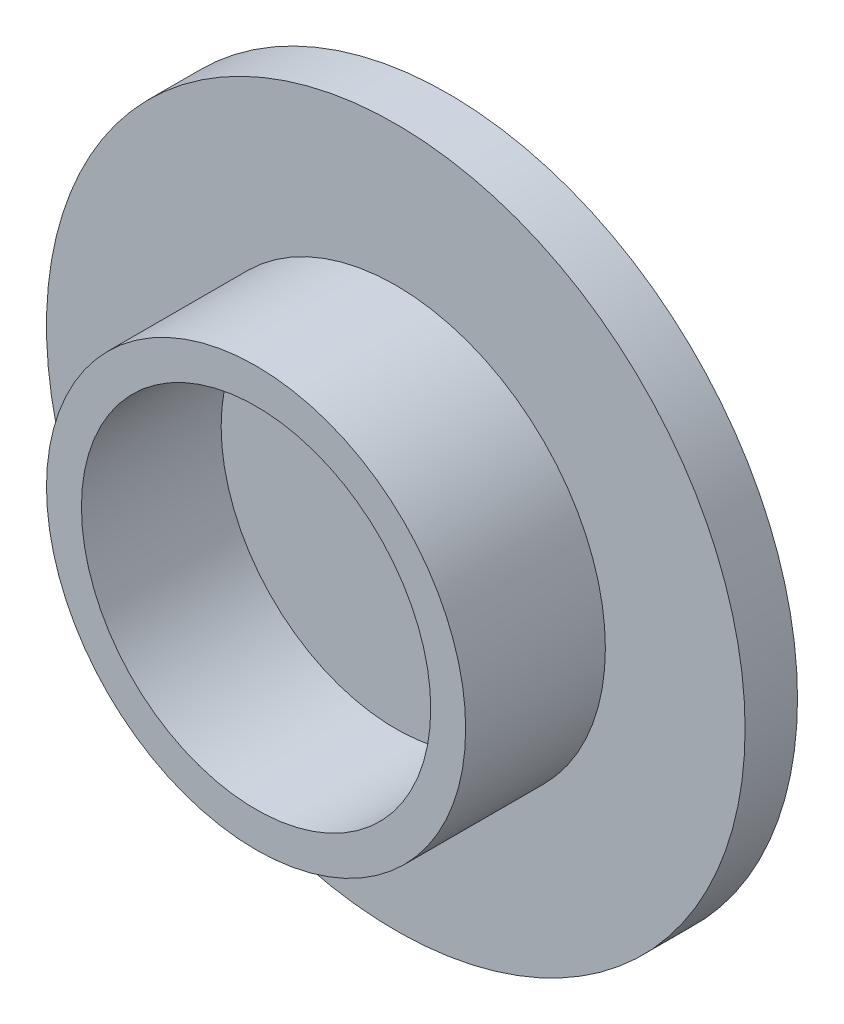
ISO-10303-21;
HEADER;
FILE_DESCRIPTION(('STEP AP214'),'2;1');
FILE_NAME('part.step','',(''),(''),'','','');
FILE_SCHEMA(('AUTOMOTIVE_DESIGN { 1 0 10303 214 1 1 1 1 }'));
ENDSEC;
DATA;
#1=APPLICATION_CONTEXT('core data for automotive mechanical design processes');
#2=APPLICATION_PROTOCOL_DEFINITION('international standard','automotive_design',2000,#1);
#3=PRODUCT_CONTEXT('',#1,'mechanical');
#4=PRODUCT('Part','Part','',(#3));
#5=PRODUCT_RELATED_PRODUCT_CATEGORY('part','',(#4));
#6=PRODUCT_DEFINITION_FORMATION('','',#4);
#7=PRODUCT_DEFINITION_CONTEXT('part definition',#1,'design');
#8=PRODUCT_DEFINITION('design','',#6,#7);
#9=PRODUCT_DEFINITION_SHAPE('','',#8);
#10=(LENGTH_UNIT() NAMED_UNIT(*) SI_UNIT(.MILLI.,.METRE.));
#11=(NAMED_UNIT(*) PLANE_ANGLE_UNIT() SI_UNIT($,.RADIAN.));
#12=(NAMED_UNIT(*) SI_UNIT($,.STERADIAN.) SOLID_ANGLE_UNIT());
#13=UNCERTAINTY_MEASURE_WITH_UNIT(LENGTH_MEASURE(1.E-05),#10,'distance_accuracy_value','');
#14=(GEOMETRIC_REPRESENTATION_CONTEXT(3) GLOBAL_UNCERTAINTY_ASSIGNED_CONTEXT((#13)) GLOBAL_UNIT_ASSIGNED_CONTEXT((#10,
#11,#12)) REPRESENTATION_CONTEXT('',''));
#15=CARTESIAN_POINT('',(0.,0.,0.));
#16=DIRECTION('',(0.,0.,1.));
#17=DIRECTION('',(1.,0.,0.));
#18=AXIS2_PLACEMENT_3D('',#15,#16,#17);
#19=CARTESIAN_POINT('',(0.,0.,3.));
#20=DIRECTION('',(0.,0.,-1.));
#21=DIRECTION('',(-1.,0.,0.));
#22=AXIS2_PLACEMENT_3D('',#19,#20,#21);
#23=CYLINDRICAL_SURFACE('',#22,20.);
#24=CARTESIAN_POINT('',(0.,0.,3.));
#25=DIRECTION('',(0.,0.,1.));
#26=DIRECTION('',(1.,0.,0.));
#27=AXIS2_PLACEMENT_3D('',#24,#25,#26);
#28=CIRCLE('',#27,20.);
#29=CARTESIAN_POINT('',(20.,0.,3.));
#30=VERTEX_POINT('',#29);
#31=EDGE_CURVE('E44',#30,#30,#28,.T.);
#32=ORIENTED_EDGE('',*,*,#31,.F.);
#33=EDGE_LOOP('',(#32));
#34=FACE_BOUND('',#33,.T.);
#35=CARTESIAN_POINT('',(0.,0.,0.));
#36=DIRECTION('',(0.,0.,1.));
#37=DIRECTION('',(1.,0.,0.));
#38=AXIS2_PLACEMENT_3D('',#35,#36,#37);
#39=CIRCLE('',#38,20.);
#40=CARTESIAN_POINT('',(20.,0.,0.));
#41=VERTEX_POINT('',#40);
#42=EDGE_CURVE('E49',#41,#41,#39,.T.);
#43=ORIENTED_EDGE('',*,*,#42,.T.);
#44=EDGE_LOOP('',(#43));
#45=FACE_BOUND('',#44,.T.);
#46=ADVANCED_FACE('F37',(#34,#45),#23,.T.);
#47=CARTESIAN_POINT('',(0.,0.,3.));
#48=DIRECTION('',(0.,0.,1.));
#49=DIRECTION('',(1.,0.,0.));
#50=AXIS2_PLACEMENT_3D('',#47,#48,#49);
#51=PLANE('',#50);
#52=CARTESIAN_POINT('',(0.,0.,3.));
#53=DIRECTION('',(0.,0.,1.));
#54=DIRECTION('',(1.,0.,0.));
#55=AXIS2_PLACEMENT_3D('',#52,#53,#54);
#56=CIRCLE('',#55,12.);
#57=CARTESIAN_POINT('',(12.,0.,3.));
#58=VERTEX_POINT('',#57);
#59=EDGE_CURVE('E57',#58,#58,#56,.T.);
#60=ORIENTED_EDGE('',*,*,#59,.F.);
#61=EDGE_LOOP('',(#60));
#62=FACE_BOUND('',#61,.T.);
#63=ORIENTED_EDGE('',*,*,#31,.T.);
#64=EDGE_LOOP('',(#63));
#65=FACE_BOUND('',#64,.T.);
#66=ADVANCED_FACE('F83',(#62,#65),#51,.T.);
#67=CARTESIAN_POINT('',(0.,0.,0.));
#68=DIRECTION('',(0.,0.,1.));
#69=DIRECTION('',(1.,0.,0.));
#70=AXIS2_PLACEMENT_3D('',#67,#68,#69);
#71=PLANE('',#70);
#72=ORIENTED_EDGE('',*,*,#42,.F.);
#73=EDGE_LOOP('',(#72));
#74=FACE_BOUND('',#73,.T.);
#75=ADVANCED_FACE('F74',(#74),#71,.F.);
#76=CARTESIAN_POINT('',(0.,0.,11.));
#77=DIRECTION('',(0.,0.,1.));
#78=DIRECTION('',(1.,0.,0.));
#79=AXIS2_PLACEMENT_3D('',#76,#77,#78);
#80=PLANE('',#79);
#81=CARTESIAN_POINT('',(0.,0.,11.));
#82=DIRECTION('',(0.,0.,1.));
#83=DIRECTION('',(1.,0.,0.));
#84=AXIS2_PLACEMENT_3D('',#81,#82,#83);
#85=CIRCLE('',#84,12.);
#86=CARTESIAN_POINT('',(12.,0.,11.));
#87=VERTEX_POINT('',#86);
#88=EDGE_CURVE('E55',#87,#87,#85,.T.);
#89=ORIENTED_EDGE('',*,*,#88,.T.);
#90=EDGE_LOOP('',(#89));
#91=FACE_BOUND('',#90,.T.);
#92=CARTESIAN_POINT('',(0.,0.,11.));
#93=DIRECTION('',(0.,0.,1.));
#94=DIRECTION('',(1.,0.,0.));
#95=AXIS2_PLACEMENT_3D('',#92,#93,#94);
#96=CIRCLE('',#95,10.);
#97=CARTESIAN_POINT('',(10.,0.,11.));
#98=VERTEX_POINT('',#97);
#99=EDGE_CURVE('E61',#98,#98,#96,.T.);
#100=ORIENTED_EDGE('',*,*,#99,.F.);
#101=EDGE_LOOP('',(#100));
#102=FACE_BOUND('',#101,.T.);
#103=ADVANCED_FACE('F71',(#91,#102),#80,.T.);
#104=CARTESIAN_POINT('',(0.,0.,11.));
#105=DIRECTION('',(0.,0.,-1.));
#106=DIRECTION('',(-1.,0.,0.));
#107=AXIS2_PLACEMENT_3D('',#104,#105,#106);
#108=CYLINDRICAL_SURFACE('',#107,12.);
#109=ORIENTED_EDGE('',*,*,#88,.F.);
#110=EDGE_LOOP('',(#109));
#111=FACE_BOUND('',#110,.T.);
#112=ORIENTED_EDGE('',*,*,#59,.T.);
#113=EDGE_LOOP('',(#112));
#114=FACE_BOUND('',#113,.T.);
#115=ADVANCED_FACE('F73',(#111,#114),#108,.T.);
#116=CARTESIAN_POINT('',(0.,0.,11.));
#117=DIRECTION('',(0.,0.,-1.));
#118=DIRECTION('',(-1.,0.,0.));
#119=AXIS2_PLACEMENT_3D('',#116,#117,#118);
#120=CYLINDRICAL_SURFACE('',#119,10.);
#121=ORIENTED_EDGE('',*,*,#99,.T.);
#122=EDGE_LOOP('',(#121));
#123=FACE_BOUND('',#122,.T.);
#124=CARTESIAN_POINT('',(0.,0.,3.));
#125=DIRECTION('',(0.,0.,1.));
#126=DIRECTION('',(1.,0.,0.));
#127=AXIS2_PLACEMENT_3D('',#124,#125,#126);
#128=CIRCLE('',#127,10.);
#129=CARTESIAN_POINT('',(10.,0.,3.));
#130=VERTEX_POINT('',#129);
#131=EDGE_CURVE('E10',#130,#130,#128,.F.);
#132=ORIENTED_EDGE('',*,*,#131,.T.);
#133=EDGE_LOOP('',(#132));
#134=FACE_BOUND('',#133,.T.);
#135=ADVANCED_FACE('F69',(#123,#134),#120,.F.);
#136=ORIENTED_EDGE('',*,*,#131,.F.);
#137=EDGE_LOOP('',(#136));
#138=FACE_BOUND('',#137,.T.);
#139=ADVANCED_FACE('F93',(#138),#51,.T.);
#140=CLOSED_SHELL('',(#46,#66,#75,#103,#115,#135,#139));
#141=MANIFOLD_SOLID_BREP('B2',#140);
#142=ADVANCED_BREP_SHAPE_REPRESENTATION('',(#18,#141),#14);
#143=SHAPE_DEFINITION_REPRESENTATION(#9,#142);
ENDSEC;
END-ISO-10303-21;
